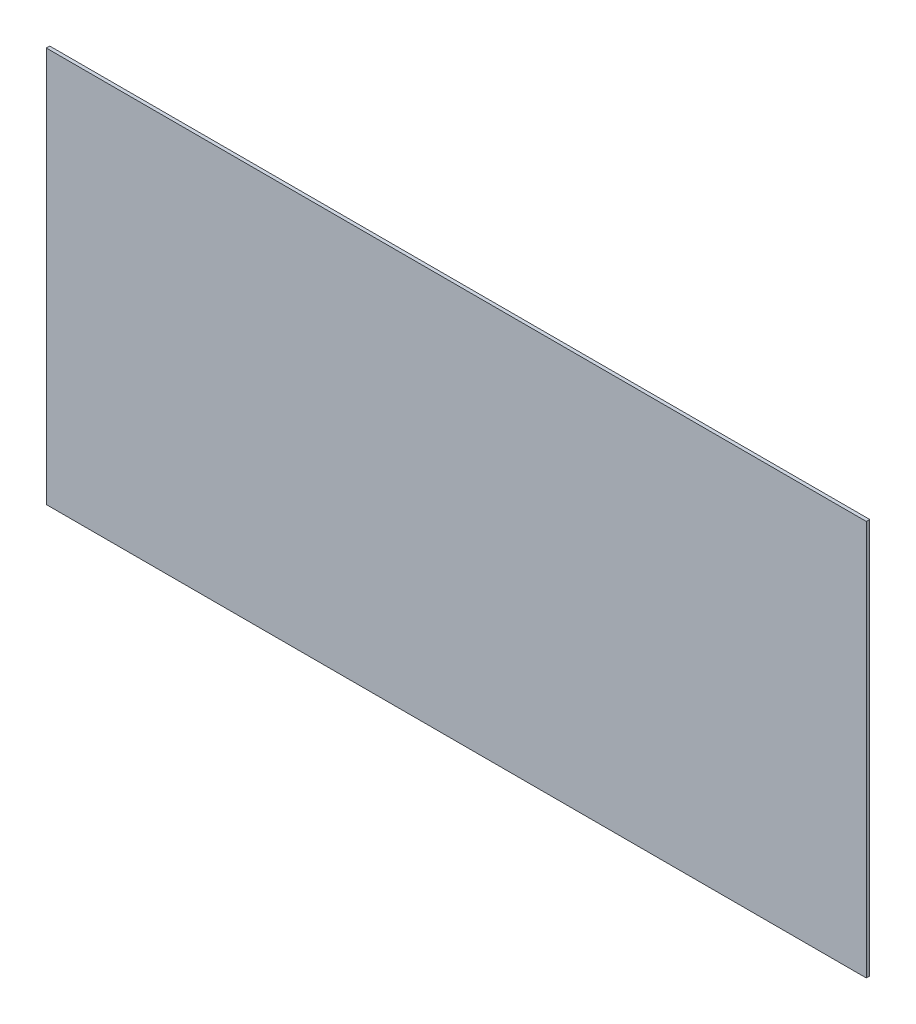
ISO-10303-21;
HEADER;
FILE_DESCRIPTION(('STEP AP214'),'2;1');
FILE_NAME('part.step','',(''),(''),'','','');
FILE_SCHEMA(('AUTOMOTIVE_DESIGN { 1 0 10303 214 1 1 1 1 }'));
ENDSEC;
DATA;
#1=APPLICATION_CONTEXT('core data for automotive mechanical design processes');
#2=APPLICATION_PROTOCOL_DEFINITION('international standard','automotive_design',2000,#1);
#3=PRODUCT_CONTEXT('',#1,'mechanical');
#4=PRODUCT('Part','Part','',(#3));
#5=PRODUCT_RELATED_PRODUCT_CATEGORY('part','',(#4));
#6=PRODUCT_DEFINITION_FORMATION('','',#4);
#7=PRODUCT_DEFINITION_CONTEXT('part definition',#1,'design');
#8=PRODUCT_DEFINITION('design','',#6,#7);
#9=PRODUCT_DEFINITION_SHAPE('','',#8);
#10=(LENGTH_UNIT() NAMED_UNIT(*) SI_UNIT(.MILLI.,.METRE.));
#11=(NAMED_UNIT(*) PLANE_ANGLE_UNIT() SI_UNIT($,.RADIAN.));
#12=(NAMED_UNIT(*) SI_UNIT($,.STERADIAN.) SOLID_ANGLE_UNIT());
#13=UNCERTAINTY_MEASURE_WITH_UNIT(LENGTH_MEASURE(1.E-05),#10,'distance_accuracy_value','');
#14=(GEOMETRIC_REPRESENTATION_CONTEXT(3) GLOBAL_UNCERTAINTY_ASSIGNED_CONTEXT((#13)) GLOBAL_UNIT_ASSIGNED_CONTEXT((#10,
#11,#12)) REPRESENTATION_CONTEXT('',''));
#15=CARTESIAN_POINT('',(0.,0.,0.));
#16=DIRECTION('',(0.,0.,1.));
#17=DIRECTION('',(1.,0.,0.));
#18=AXIS2_PLACEMENT_3D('',#15,#16,#17);
#19=CARTESIAN_POINT('',(-238.5,115.,2.));
#20=DIRECTION('',(1.,0.,0.));
#21=DIRECTION('',(0.,1.,0.));
#22=AXIS2_PLACEMENT_3D('',#19,#20,#21);
#23=PLANE('',#22);
#24=DIRECTION('',(0.,-1.,0.));
#25=VECTOR('',#24,1.);
#26=CARTESIAN_POINT('',(-238.5,115.,0.));
#27=LINE('',#26,#25);
#28=CARTESIAN_POINT('',(-238.5,115.,0.));
#29=VERTEX_POINT('',#28);
#30=CARTESIAN_POINT('',(-238.5,-115.,0.));
#31=VERTEX_POINT('',#30);
#32=EDGE_CURVE('E110',#29,#31,#27,.T.);
#33=ORIENTED_EDGE('',*,*,#32,.T.);
#34=DIRECTION('',(0.,0.,-1.));
#35=VECTOR('',#34,1.);
#36=CARTESIAN_POINT('',(-238.5,-115.,2.));
#37=LINE('',#36,#35);
#38=CARTESIAN_POINT('',(-238.5,-115.,2.));
#39=VERTEX_POINT('',#38);
#40=EDGE_CURVE('E11',#39,#31,#37,.T.);
#41=ORIENTED_EDGE('',*,*,#40,.F.);
#42=DIRECTION('',(0.,-1.,0.));
#43=VECTOR('',#42,1.);
#44=CARTESIAN_POINT('',(-238.5,115.,2.));
#45=LINE('',#44,#43);
#46=CARTESIAN_POINT('',(-238.5,115.,2.));
#47=VERTEX_POINT('',#46);
#48=EDGE_CURVE('E94',#47,#39,#45,.T.);
#49=ORIENTED_EDGE('',*,*,#48,.F.);
#50=DIRECTION('',(0.,0.,-1.));
#51=VECTOR('',#50,1.);
#52=CARTESIAN_POINT('',(-238.5,115.,2.));
#53=LINE('',#52,#51);
#54=EDGE_CURVE('E106',#47,#29,#53,.T.);
#55=ORIENTED_EDGE('',*,*,#54,.T.);
#56=EDGE_LOOP('',(#33,#41,#49,#55));
#57=FACE_BOUND('',#56,.T.);
#58=ADVANCED_FACE('F42',(#57),#23,.F.);
#59=CARTESIAN_POINT('',(238.5,-115.,2.));
#60=DIRECTION('',(0.,1.,0.));
#61=DIRECTION('',(-1.,0.,0.));
#62=AXIS2_PLACEMENT_3D('',#59,#60,#61);
#63=PLANE('',#62);
#64=DIRECTION('',(1.,0.,0.));
#65=VECTOR('',#64,1.);
#66=CARTESIAN_POINT('',(238.5,-115.,0.));
#67=LINE('',#66,#65);
#68=CARTESIAN_POINT('',(238.5,-115.,0.));
#69=VERTEX_POINT('',#68);
#70=EDGE_CURVE('E99',#31,#69,#67,.T.);
#71=ORIENTED_EDGE('',*,*,#70,.T.);
#72=DIRECTION('',(0.,0.,-1.));
#73=VECTOR('',#72,1.);
#74=CARTESIAN_POINT('',(238.5,-115.,2.));
#75=LINE('',#74,#73);
#76=CARTESIAN_POINT('',(238.5,-115.,2.));
#77=VERTEX_POINT('',#76);
#78=EDGE_CURVE('E51',#77,#69,#75,.T.);
#79=ORIENTED_EDGE('',*,*,#78,.F.);
#80=DIRECTION('',(1.,0.,0.));
#81=VECTOR('',#80,1.);
#82=CARTESIAN_POINT('',(238.5,-115.,2.));
#83=LINE('',#82,#81);
#84=EDGE_CURVE('E89',#39,#77,#83,.T.);
#85=ORIENTED_EDGE('',*,*,#84,.F.);
#86=ORIENTED_EDGE('',*,*,#40,.T.);
#87=EDGE_LOOP('',(#71,#79,#85,#86));
#88=FACE_BOUND('',#87,.T.);
#89=ADVANCED_FACE('F98',(#88),#63,.F.);
#90=CARTESIAN_POINT('',(238.5,115.,2.));
#91=DIRECTION('',(-1.,0.,0.));
#92=DIRECTION('',(0.,0.,1.));
#93=AXIS2_PLACEMENT_3D('',#90,#91,#92);
#94=PLANE('',#93);
#95=DIRECTION('',(0.,1.,0.));
#96=VECTOR('',#95,1.);
#97=CARTESIAN_POINT('',(238.5,115.,0.));
#98=LINE('',#97,#96);
#99=CARTESIAN_POINT('',(238.5,115.,0.));
#100=VERTEX_POINT('',#99);
#101=EDGE_CURVE('E76',#69,#100,#98,.T.);
#102=ORIENTED_EDGE('',*,*,#101,.T.);
#103=DIRECTION('',(0.,0.,-1.));
#104=VECTOR('',#103,1.);
#105=CARTESIAN_POINT('',(238.5,115.,2.));
#106=LINE('',#105,#104);
#107=CARTESIAN_POINT('',(238.5,115.,2.));
#108=VERTEX_POINT('',#107);
#109=EDGE_CURVE('E101',#108,#100,#106,.T.);
#110=ORIENTED_EDGE('',*,*,#109,.F.);
#111=DIRECTION('',(0.,1.,0.));
#112=VECTOR('',#111,1.);
#113=CARTESIAN_POINT('',(238.5,115.,2.));
#114=LINE('',#113,#112);
#115=EDGE_CURVE('E92',#77,#108,#114,.T.);
#116=ORIENTED_EDGE('',*,*,#115,.F.);
#117=ORIENTED_EDGE('',*,*,#78,.T.);
#118=EDGE_LOOP('',(#102,#110,#116,#117));
#119=FACE_BOUND('',#118,.T.);
#120=ADVANCED_FACE('F102',(#119),#94,.F.);
#121=CARTESIAN_POINT('',(238.5,115.,2.));
#122=DIRECTION('',(0.,-1.,0.));
#123=DIRECTION('',(1.,0.,0.));
#124=AXIS2_PLACEMENT_3D('',#121,#122,#123);
#125=PLANE('',#124);
#126=DIRECTION('',(-1.,0.,0.));
#127=VECTOR('',#126,1.);
#128=CARTESIAN_POINT('',(238.5,115.,0.));
#129=LINE('',#128,#127);
#130=EDGE_CURVE('E82',#100,#29,#129,.T.);
#131=ORIENTED_EDGE('',*,*,#130,.T.);
#132=ORIENTED_EDGE('',*,*,#54,.F.);
#133=DIRECTION('',(-1.,0.,0.));
#134=VECTOR('',#133,1.);
#135=CARTESIAN_POINT('',(238.5,115.,2.));
#136=LINE('',#135,#134);
#137=EDGE_CURVE('E59',#108,#47,#136,.T.);
#138=ORIENTED_EDGE('',*,*,#137,.F.);
#139=ORIENTED_EDGE('',*,*,#109,.T.);
#140=EDGE_LOOP('',(#131,#132,#138,#139));
#141=FACE_BOUND('',#140,.T.);
#142=ADVANCED_FACE('F123',(#141),#125,.F.);
#143=CARTESIAN_POINT('',(0.,0.,2.));
#144=DIRECTION('',(0.,0.,-1.));
#145=DIRECTION('',(-1.,0.,0.));
#146=AXIS2_PLACEMENT_3D('',#143,#144,#145);
#147=PLANE('',#146);
#148=ORIENTED_EDGE('',*,*,#48,.T.);
#149=ORIENTED_EDGE('',*,*,#84,.T.);
#150=ORIENTED_EDGE('',*,*,#115,.T.);
#151=ORIENTED_EDGE('',*,*,#137,.T.);
#152=EDGE_LOOP('',(#148,#149,#150,#151));
#153=FACE_BOUND('',#152,.T.);
#154=ADVANCED_FACE('F90',(#153),#147,.F.);
#155=CARTESIAN_POINT('',(0.,0.,0.));
#156=DIRECTION('',(0.,0.,-1.));
#157=DIRECTION('',(-1.,0.,0.));
#158=AXIS2_PLACEMENT_3D('',#155,#156,#157);
#159=PLANE('',#158);
#160=ORIENTED_EDGE('',*,*,#32,.F.);
#161=ORIENTED_EDGE('',*,*,#130,.F.);
#162=ORIENTED_EDGE('',*,*,#101,.F.);
#163=ORIENTED_EDGE('',*,*,#70,.F.);
#164=EDGE_LOOP('',(#160,#161,#162,#163));
#165=FACE_BOUND('',#164,.T.);
#166=ADVANCED_FACE('F126',(#165),#159,.T.);
#167=CLOSED_SHELL('',(#58,#89,#120,#142,#154,#166));
#168=MANIFOLD_SOLID_BREP('B2',#167);
#169=ADVANCED_BREP_SHAPE_REPRESENTATION('',(#18,#168),#14);
#170=SHAPE_DEFINITION_REPRESENTATION(#9,#169);
ENDSEC;
END-ISO-10303-21;
